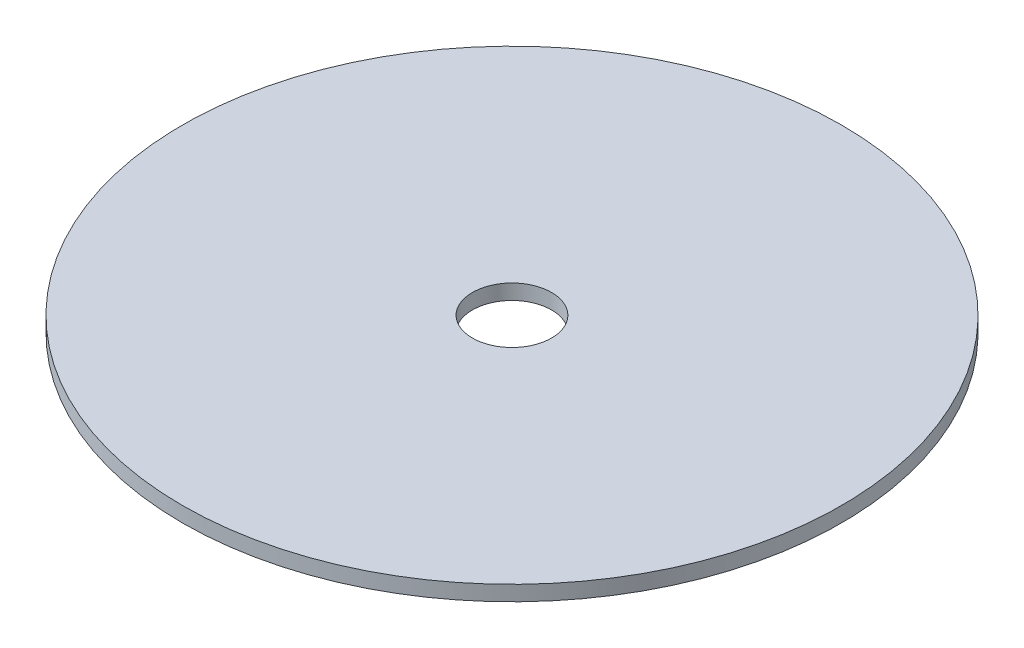
ISO-10303-21;
HEADER;
FILE_DESCRIPTION(('STEP AP214'),'2;1');
FILE_NAME('part.step','',(''),(''),'','','');
FILE_SCHEMA(('AUTOMOTIVE_DESIGN { 1 0 10303 214 1 1 1 1 }'));
ENDSEC;
DATA;
#1=APPLICATION_CONTEXT('core data for automotive mechanical design processes');
#2=APPLICATION_PROTOCOL_DEFINITION('international standard','automotive_design',2000,#1);
#3=PRODUCT_CONTEXT('',#1,'mechanical');
#4=PRODUCT('Part','Part','',(#3));
#5=PRODUCT_RELATED_PRODUCT_CATEGORY('part','',(#4));
#6=PRODUCT_DEFINITION_FORMATION('','',#4);
#7=PRODUCT_DEFINITION_CONTEXT('part definition',#1,'design');
#8=PRODUCT_DEFINITION('design','',#6,#7);
#9=PRODUCT_DEFINITION_SHAPE('','',#8);
#10=(LENGTH_UNIT() NAMED_UNIT(*) SI_UNIT(.MILLI.,.METRE.));
#11=(NAMED_UNIT(*) PLANE_ANGLE_UNIT() SI_UNIT($,.RADIAN.));
#12=(NAMED_UNIT(*) SI_UNIT($,.STERADIAN.) SOLID_ANGLE_UNIT());
#13=UNCERTAINTY_MEASURE_WITH_UNIT(LENGTH_MEASURE(1.E-05),#10,'distance_accuracy_value','');
#14=(GEOMETRIC_REPRESENTATION_CONTEXT(3) GLOBAL_UNCERTAINTY_ASSIGNED_CONTEXT((#13)) GLOBAL_UNIT_ASSIGNED_CONTEXT((#10,
#11,#12)) REPRESENTATION_CONTEXT('',''));
#15=CARTESIAN_POINT('',(0.,0.,0.));
#16=DIRECTION('',(0.,0.,1.));
#17=DIRECTION('',(1.,0.,0.));
#18=AXIS2_PLACEMENT_3D('',#15,#16,#17);
#19=CARTESIAN_POINT('',(0.,-2.3,0.));
#20=DIRECTION('',(0.,1.,0.));
#21=DIRECTION('',(0.,0.,1.));
#22=AXIS2_PLACEMENT_3D('',#19,#20,#21);
#23=CYLINDRICAL_SURFACE('',#22,50.);
#24=CARTESIAN_POINT('',(0.,-2.3,0.));
#25=DIRECTION('',(0.,1.,0.));
#26=DIRECTION('',(0.,0.,1.));
#27=AXIS2_PLACEMENT_3D('',#24,#25,#26);
#28=CIRCLE('',#27,50.);
#29=CARTESIAN_POINT('',(0.,-2.3,50.));
#30=VERTEX_POINT('',#29);
#31=EDGE_CURVE('E10',#30,#30,#28,.T.);
#32=ORIENTED_EDGE('',*,*,#31,.T.);
#33=EDGE_LOOP('',(#32));
#34=FACE_BOUND('',#33,.T.);
#35=CARTESIAN_POINT('',(0.,0.,0.));
#36=DIRECTION('',(0.,1.,0.));
#37=DIRECTION('',(0.,0.,1.));
#38=AXIS2_PLACEMENT_3D('',#35,#36,#37);
#39=CIRCLE('',#38,50.);
#40=CARTESIAN_POINT('',(0.,0.,50.));
#41=VERTEX_POINT('',#40);
#42=EDGE_CURVE('E40',#41,#41,#39,.T.);
#43=ORIENTED_EDGE('',*,*,#42,.F.);
#44=EDGE_LOOP('',(#43));
#45=FACE_BOUND('',#44,.T.);
#46=ADVANCED_FACE('F37',(#34,#45),#23,.T.);
#47=CARTESIAN_POINT('',(0.,-2.3,0.));
#48=DIRECTION('',(0.,1.,0.));
#49=DIRECTION('',(0.,0.,1.));
#50=AXIS2_PLACEMENT_3D('',#47,#48,#49);
#51=PLANE('',#50);
#52=CARTESIAN_POINT('',(0.,-2.3,0.));
#53=DIRECTION('',(0.,1.,0.));
#54=DIRECTION('',(0.,0.,1.));
#55=AXIS2_PLACEMENT_3D('',#52,#53,#54);
#56=CIRCLE('',#55,6.);
#57=CARTESIAN_POINT('',(0.,-2.3,6.));
#58=VERTEX_POINT('',#57);
#59=EDGE_CURVE('E47',#58,#58,#56,.T.);
#60=ORIENTED_EDGE('',*,*,#59,.T.);
#61=EDGE_LOOP('',(#60));
#62=FACE_BOUND('',#61,.T.);
#63=ORIENTED_EDGE('',*,*,#31,.F.);
#64=EDGE_LOOP('',(#63));
#65=FACE_BOUND('',#64,.T.);
#66=ADVANCED_FACE('F61',(#62,#65),#51,.F.);
#67=CARTESIAN_POINT('',(0.,0.,0.));
#68=DIRECTION('',(0.,1.,0.));
#69=DIRECTION('',(0.,0.,1.));
#70=AXIS2_PLACEMENT_3D('',#67,#68,#69);
#71=PLANE('',#70);
#72=CARTESIAN_POINT('',(0.,0.,0.));
#73=DIRECTION('',(0.,1.,0.));
#74=DIRECTION('',(0.,0.,1.));
#75=AXIS2_PLACEMENT_3D('',#72,#73,#74);
#76=CIRCLE('',#75,6.);
#77=CARTESIAN_POINT('',(0.,0.,6.));
#78=VERTEX_POINT('',#77);
#79=EDGE_CURVE('E51',#78,#78,#76,.T.);
#80=ORIENTED_EDGE('',*,*,#79,.F.);
#81=EDGE_LOOP('',(#80));
#82=FACE_BOUND('',#81,.T.);
#83=ORIENTED_EDGE('',*,*,#42,.T.);
#84=EDGE_LOOP('',(#83));
#85=FACE_BOUND('',#84,.T.);
#86=ADVANCED_FACE('F58',(#82,#85),#71,.T.);
#87=CARTESIAN_POINT('',(0.,-10.,0.));
#88=DIRECTION('',(0.,1.,0.));
#89=DIRECTION('',(0.,0.,1.));
#90=AXIS2_PLACEMENT_3D('',#87,#88,#89);
#91=CYLINDRICAL_SURFACE('',#90,6.);
#92=ORIENTED_EDGE('',*,*,#79,.T.);
#93=EDGE_LOOP('',(#92));
#94=FACE_BOUND('',#93,.T.);
#95=ORIENTED_EDGE('',*,*,#59,.F.);
#96=EDGE_LOOP('',(#95));
#97=FACE_BOUND('',#96,.T.);
#98=ADVANCED_FACE('F55',(#94,#97),#91,.F.);
#99=CLOSED_SHELL('',(#46,#66,#86,#98));
#100=MANIFOLD_SOLID_BREP('B2',#99);
#101=ADVANCED_BREP_SHAPE_REPRESENTATION('',(#18,#100),#14);
#102=SHAPE_DEFINITION_REPRESENTATION(#9,#101);
ENDSEC;
END-ISO-10303-21;
